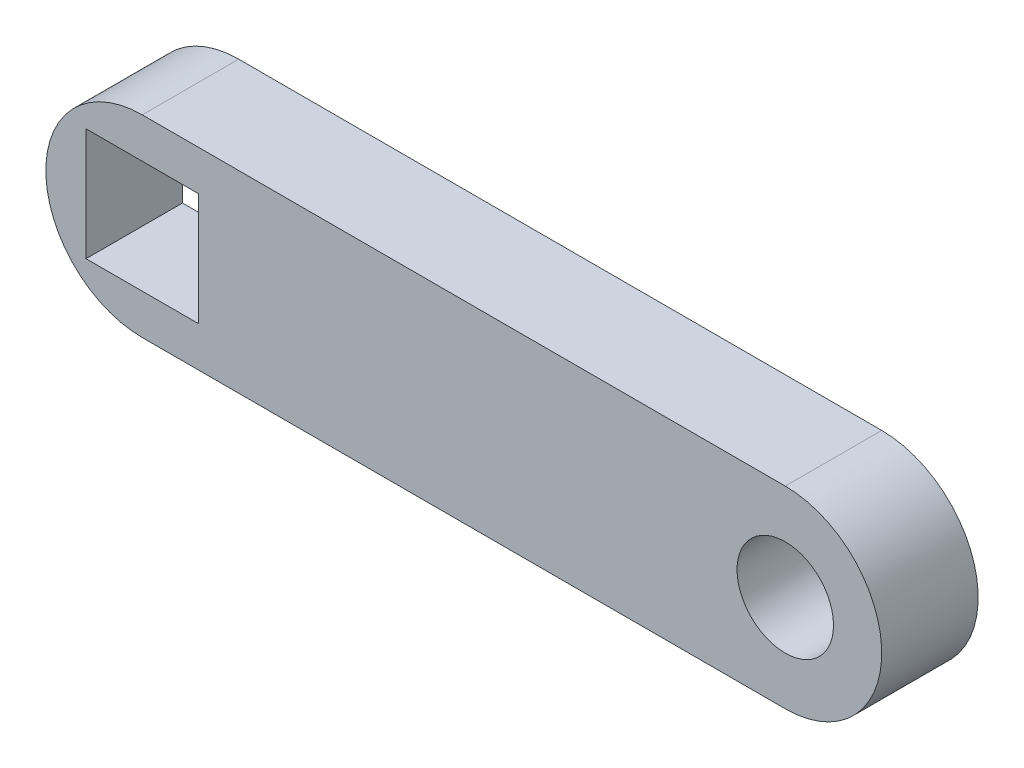
ISO-10303-21;
HEADER;
FILE_DESCRIPTION(('STEP AP214'),'2;1');
FILE_NAME('part.step','',(''),(''),'','','');
FILE_SCHEMA(('AUTOMOTIVE_DESIGN { 1 0 10303 214 1 1 1 1 }'));
ENDSEC;
DATA;
#1=APPLICATION_CONTEXT('core data for automotive mechanical design processes');
#2=APPLICATION_PROTOCOL_DEFINITION('international standard','automotive_design',2000,#1);
#3=PRODUCT_CONTEXT('',#1,'mechanical');
#4=PRODUCT('Part','Part','',(#3));
#5=PRODUCT_RELATED_PRODUCT_CATEGORY('part','',(#4));
#6=PRODUCT_DEFINITION_FORMATION('','',#4);
#7=PRODUCT_DEFINITION_CONTEXT('part definition',#1,'design');
#8=PRODUCT_DEFINITION('design','',#6,#7);
#9=PRODUCT_DEFINITION_SHAPE('','',#8);
#10=(LENGTH_UNIT() NAMED_UNIT(*) SI_UNIT(.MILLI.,.METRE.));
#11=(NAMED_UNIT(*) PLANE_ANGLE_UNIT() SI_UNIT($,.RADIAN.));
#12=(NAMED_UNIT(*) SI_UNIT($,.STERADIAN.) SOLID_ANGLE_UNIT());
#13=UNCERTAINTY_MEASURE_WITH_UNIT(LENGTH_MEASURE(1.E-05),#10,'distance_accuracy_value','');
#14=(GEOMETRIC_REPRESENTATION_CONTEXT(3) GLOBAL_UNCERTAINTY_ASSIGNED_CONTEXT((#13)) GLOBAL_UNIT_ASSIGNED_CONTEXT((#10,
#11,#12)) REPRESENTATION_CONTEXT('',''));
#15=CARTESIAN_POINT('',(0.,0.,0.));
#16=DIRECTION('',(0.,0.,1.));
#17=DIRECTION('',(1.,0.,0.));
#18=AXIS2_PLACEMENT_3D('',#15,#16,#17);
#19=CARTESIAN_POINT('',(0.,1.75,3.));
#20=DIRECTION('',(0.,1.,0.));
#21=DIRECTION('',(0.,0.,1.));
#22=AXIS2_PLACEMENT_3D('',#19,#20,#21);
#23=PLANE('',#22);
#24=DIRECTION('',(1.,0.,0.));
#25=VECTOR('',#24,1.);
#26=CARTESIAN_POINT('',(0.,1.75,0.));
#27=LINE('',#26,#25);
#28=CARTESIAN_POINT('',(-1.75,1.75,0.));
#29=VERTEX_POINT('',#28);
#30=CARTESIAN_POINT('',(1.75,1.75,0.));
#31=VERTEX_POINT('',#30);
#32=EDGE_CURVE('E146',#29,#31,#27,.T.);
#33=ORIENTED_EDGE('',*,*,#32,.T.);
#34=DIRECTION('',(0.,0.,-1.));
#35=VECTOR('',#34,1.);
#36=CARTESIAN_POINT('',(1.75,1.75,3.));
#37=LINE('',#36,#35);
#38=CARTESIAN_POINT('',(1.75,1.75,3.));
#39=VERTEX_POINT('',#38);
#40=EDGE_CURVE('E11',#39,#31,#37,.T.);
#41=ORIENTED_EDGE('',*,*,#40,.F.);
#42=DIRECTION('',(1.,0.,0.));
#43=VECTOR('',#42,1.);
#44=CARTESIAN_POINT('',(0.,1.75,3.));
#45=LINE('',#44,#43);
#46=CARTESIAN_POINT('',(-1.75,1.75,3.));
#47=VERTEX_POINT('',#46);
#48=EDGE_CURVE('E114',#47,#39,#45,.T.);
#49=ORIENTED_EDGE('',*,*,#48,.F.);
#50=DIRECTION('',(0.,0.,-1.));
#51=VECTOR('',#50,1.);
#52=CARTESIAN_POINT('',(-1.75,1.75,3.));
#53=LINE('',#52,#51);
#54=EDGE_CURVE('E54',#47,#29,#53,.T.);
#55=ORIENTED_EDGE('',*,*,#54,.T.);
#56=EDGE_LOOP('',(#33,#41,#49,#55));
#57=FACE_BOUND('',#56,.T.);
#58=ADVANCED_FACE('F35',(#57),#23,.F.);
#59=CARTESIAN_POINT('',(1.75,0.,3.));
#60=DIRECTION('',(1.,0.,0.));
#61=DIRECTION('',(0.,0.,-1.));
#62=AXIS2_PLACEMENT_3D('',#59,#60,#61);
#63=PLANE('',#62);
#64=DIRECTION('',(0.,-1.,0.));
#65=VECTOR('',#64,1.);
#66=CARTESIAN_POINT('',(1.75,0.,0.));
#67=LINE('',#66,#65);
#68=CARTESIAN_POINT('',(1.75,-1.75,0.));
#69=VERTEX_POINT('',#68);
#70=EDGE_CURVE('E120',#31,#69,#67,.T.);
#71=ORIENTED_EDGE('',*,*,#70,.T.);
#72=DIRECTION('',(0.,0.,-1.));
#73=VECTOR('',#72,1.);
#74=CARTESIAN_POINT('',(1.75,-1.75,3.));
#75=LINE('',#74,#73);
#76=CARTESIAN_POINT('',(1.75,-1.75,3.));
#77=VERTEX_POINT('',#76);
#78=EDGE_CURVE('E45',#77,#69,#75,.T.);
#79=ORIENTED_EDGE('',*,*,#78,.F.);
#80=DIRECTION('',(0.,-1.,0.));
#81=VECTOR('',#80,1.);
#82=CARTESIAN_POINT('',(1.75,0.,3.));
#83=LINE('',#82,#81);
#84=EDGE_CURVE('E108',#39,#77,#83,.T.);
#85=ORIENTED_EDGE('',*,*,#84,.F.);
#86=ORIENTED_EDGE('',*,*,#40,.T.);
#87=EDGE_LOOP('',(#71,#79,#85,#86));
#88=FACE_BOUND('',#87,.T.);
#89=ADVANCED_FACE('F119',(#88),#63,.F.);
#90=CARTESIAN_POINT('',(0.,-1.75,3.));
#91=DIRECTION('',(0.,1.,0.));
#92=DIRECTION('',(0.,0.,1.));
#93=AXIS2_PLACEMENT_3D('',#90,#91,#92);
#94=PLANE('',#93);
#95=DIRECTION('',(1.,0.,0.));
#96=VECTOR('',#95,1.);
#97=CARTESIAN_POINT('',(0.,-1.75,0.));
#98=LINE('',#97,#96);
#99=CARTESIAN_POINT('',(-1.75,-1.75,0.));
#100=VERTEX_POINT('',#99);
#101=EDGE_CURVE('E149',#100,#69,#98,.T.);
#102=ORIENTED_EDGE('',*,*,#101,.F.);
#103=DIRECTION('',(0.,0.,-1.));
#104=VECTOR('',#103,1.);
#105=CARTESIAN_POINT('',(-1.75,-1.75,3.));
#106=LINE('',#105,#104);
#107=CARTESIAN_POINT('',(-1.75,-1.75,3.));
#108=VERTEX_POINT('',#107);
#109=EDGE_CURVE('E80',#108,#100,#106,.T.);
#110=ORIENTED_EDGE('',*,*,#109,.F.);
#111=DIRECTION('',(1.,0.,0.));
#112=VECTOR('',#111,1.);
#113=CARTESIAN_POINT('',(0.,-1.75,3.));
#114=LINE('',#113,#112);
#115=EDGE_CURVE('E113',#108,#77,#114,.T.);
#116=ORIENTED_EDGE('',*,*,#115,.T.);
#117=ORIENTED_EDGE('',*,*,#78,.T.);
#118=EDGE_LOOP('',(#102,#110,#116,#117));
#119=FACE_BOUND('',#118,.T.);
#120=ADVANCED_FACE('F124',(#119),#94,.T.);
#121=CARTESIAN_POINT('',(20.,0.,3.));
#122=DIRECTION('',(0.,0.,-1.));
#123=DIRECTION('',(-1.,0.,0.));
#124=AXIS2_PLACEMENT_3D('',#121,#122,#123);
#125=CYLINDRICAL_SURFACE('',#124,3.);
#126=CARTESIAN_POINT('',(20.,0.,0.));
#127=DIRECTION('',(0.,0.,1.));
#128=DIRECTION('',(1.,0.,0.));
#129=AXIS2_PLACEMENT_3D('',#126,#127,#128);
#130=CIRCLE('',#129,3.);
#131=CARTESIAN_POINT('',(20.,3.,0.));
#132=VERTEX_POINT('',#131);
#133=CARTESIAN_POINT('',(20.,-3.,0.));
#134=VERTEX_POINT('',#133);
#135=EDGE_CURVE('E134',#132,#134,#130,.F.);
#136=ORIENTED_EDGE('',*,*,#135,.F.);
#137=DIRECTION('',(0.,0.,-1.));
#138=VECTOR('',#137,1.);
#139=CARTESIAN_POINT('',(20.,3.,3.));
#140=LINE('',#139,#138);
#141=CARTESIAN_POINT('',(20.,3.,3.));
#142=VERTEX_POINT('',#141);
#143=EDGE_CURVE('E39',#142,#132,#140,.T.);
#144=ORIENTED_EDGE('',*,*,#143,.F.);
#145=CARTESIAN_POINT('',(20.,0.,3.));
#146=DIRECTION('',(0.,0.,1.));
#147=DIRECTION('',(1.,0.,0.));
#148=AXIS2_PLACEMENT_3D('',#145,#146,#147);
#149=CIRCLE('',#148,3.);
#150=CARTESIAN_POINT('',(20.,-3.,3.));
#151=VERTEX_POINT('',#150);
#152=EDGE_CURVE('E187',#142,#151,#149,.F.);
#153=ORIENTED_EDGE('',*,*,#152,.T.);
#154=DIRECTION('',(0.,0.,-1.));
#155=VECTOR('',#154,1.);
#156=CARTESIAN_POINT('',(20.,-3.,3.));
#157=LINE('',#156,#155);
#158=EDGE_CURVE('E127',#151,#134,#157,.T.);
#159=ORIENTED_EDGE('',*,*,#158,.T.);
#160=EDGE_LOOP('',(#136,#144,#153,#159));
#161=FACE_BOUND('',#160,.T.);
#162=ADVANCED_FACE('F169',(#161),#125,.T.);
#163=CARTESIAN_POINT('',(0.,3.,3.));
#164=DIRECTION('',(0.,1.,0.));
#165=DIRECTION('',(0.,0.,1.));
#166=AXIS2_PLACEMENT_3D('',#163,#164,#165);
#167=PLANE('',#166);
#168=DIRECTION('',(1.,0.,0.));
#169=VECTOR('',#168,1.);
#170=CARTESIAN_POINT('',(0.,3.,0.));
#171=LINE('',#170,#169);
#172=CARTESIAN_POINT('',(0.,3.,0.));
#173=VERTEX_POINT('',#172);
#174=EDGE_CURVE('E137',#173,#132,#171,.T.);
#175=ORIENTED_EDGE('',*,*,#174,.F.);
#176=DIRECTION('',(0.,0.,-1.));
#177=VECTOR('',#176,1.);
#178=CARTESIAN_POINT('',(0.,3.,3.));
#179=LINE('',#178,#177);
#180=CARTESIAN_POINT('',(0.,3.,3.));
#181=VERTEX_POINT('',#180);
#182=EDGE_CURVE('E159',#181,#173,#179,.T.);
#183=ORIENTED_EDGE('',*,*,#182,.F.);
#184=DIRECTION('',(1.,0.,0.));
#185=VECTOR('',#184,1.);
#186=CARTESIAN_POINT('',(0.,3.,3.));
#187=LINE('',#186,#185);
#188=EDGE_CURVE('E168',#181,#142,#187,.T.);
#189=ORIENTED_EDGE('',*,*,#188,.T.);
#190=ORIENTED_EDGE('',*,*,#143,.T.);
#191=EDGE_LOOP('',(#175,#183,#189,#190));
#192=FACE_BOUND('',#191,.T.);
#193=ADVANCED_FACE('F166',(#192),#167,.T.);
#194=CARTESIAN_POINT('',(0.,0.,3.));
#195=DIRECTION('',(0.,0.,-1.));
#196=DIRECTION('',(-1.,0.,0.));
#197=AXIS2_PLACEMENT_3D('',#194,#195,#196);
#198=CYLINDRICAL_SURFACE('',#197,3.);
#199=CARTESIAN_POINT('',(0.,0.,0.));
#200=DIRECTION('',(0.,0.,1.));
#201=DIRECTION('',(1.,0.,0.));
#202=AXIS2_PLACEMENT_3D('',#199,#200,#201);
#203=CIRCLE('',#202,3.);
#204=CARTESIAN_POINT('',(0.,-3.,0.));
#205=VERTEX_POINT('',#204);
#206=EDGE_CURVE('E140',#173,#205,#203,.T.);
#207=ORIENTED_EDGE('',*,*,#206,.T.);
#208=DIRECTION('',(0.,0.,-1.));
#209=VECTOR('',#208,1.);
#210=CARTESIAN_POINT('',(0.,-3.,3.));
#211=LINE('',#210,#209);
#212=CARTESIAN_POINT('',(0.,-3.,3.));
#213=VERTEX_POINT('',#212);
#214=EDGE_CURVE('E158',#213,#205,#211,.T.);
#215=ORIENTED_EDGE('',*,*,#214,.F.);
#216=CARTESIAN_POINT('',(0.,0.,3.));
#217=DIRECTION('',(0.,0.,1.));
#218=DIRECTION('',(1.,0.,0.));
#219=AXIS2_PLACEMENT_3D('',#216,#217,#218);
#220=CIRCLE('',#219,3.);
#221=EDGE_CURVE('E177',#181,#213,#220,.T.);
#222=ORIENTED_EDGE('',*,*,#221,.F.);
#223=ORIENTED_EDGE('',*,*,#182,.T.);
#224=EDGE_LOOP('',(#207,#215,#222,#223));
#225=FACE_BOUND('',#224,.T.);
#226=ADVANCED_FACE('F175',(#225),#198,.T.);
#227=CARTESIAN_POINT('',(0.,-3.,3.));
#228=DIRECTION('',(0.,-1.,0.));
#229=DIRECTION('',(1.,0.,0.));
#230=AXIS2_PLACEMENT_3D('',#227,#228,#229);
#231=PLANE('',#230);
#232=DIRECTION('',(-1.,0.,0.));
#233=VECTOR('',#232,1.);
#234=CARTESIAN_POINT('',(0.,-3.,0.));
#235=LINE('',#234,#233);
#236=EDGE_CURVE('E143',#134,#205,#235,.T.);
#237=ORIENTED_EDGE('',*,*,#236,.F.);
#238=ORIENTED_EDGE('',*,*,#158,.F.);
#239=DIRECTION('',(-1.,0.,0.));
#240=VECTOR('',#239,1.);
#241=CARTESIAN_POINT('',(0.,-3.,3.));
#242=LINE('',#241,#240);
#243=EDGE_CURVE('E180',#151,#213,#242,.T.);
#244=ORIENTED_EDGE('',*,*,#243,.T.);
#245=ORIENTED_EDGE('',*,*,#214,.T.);
#246=EDGE_LOOP('',(#237,#238,#244,#245));
#247=FACE_BOUND('',#246,.T.);
#248=ADVANCED_FACE('F181',(#247),#231,.T.);
#249=CARTESIAN_POINT('',(20.,0.,3.));
#250=DIRECTION('',(0.,0.,-1.));
#251=DIRECTION('',(-1.,0.,0.));
#252=AXIS2_PLACEMENT_3D('',#249,#250,#251);
#253=CYLINDRICAL_SURFACE('',#252,1.5);
#254=CARTESIAN_POINT('',(20.,0.,3.));
#255=DIRECTION('',(0.,0.,1.));
#256=DIRECTION('',(1.,0.,0.));
#257=AXIS2_PLACEMENT_3D('',#254,#255,#256);
#258=CIRCLE('',#257,1.5);
#259=CARTESIAN_POINT('',(21.5,0.,3.));
#260=VERTEX_POINT('',#259);
#261=EDGE_CURVE('E154',#260,#260,#258,.T.);
#262=ORIENTED_EDGE('',*,*,#261,.T.);
#263=EDGE_LOOP('',(#262));
#264=FACE_BOUND('',#263,.T.);
#265=CARTESIAN_POINT('',(20.,0.,0.));
#266=DIRECTION('',(0.,0.,1.));
#267=DIRECTION('',(1.,0.,0.));
#268=AXIS2_PLACEMENT_3D('',#265,#266,#267);
#269=CIRCLE('',#268,1.5);
#270=CARTESIAN_POINT('',(21.5,0.,0.));
#271=VERTEX_POINT('',#270);
#272=EDGE_CURVE('E131',#271,#271,#269,.T.);
#273=ORIENTED_EDGE('',*,*,#272,.F.);
#274=EDGE_LOOP('',(#273));
#275=FACE_BOUND('',#274,.T.);
#276=ADVANCED_FACE('F37',(#264,#275),#253,.F.);
#277=CARTESIAN_POINT('',(-1.75,0.,3.));
#278=DIRECTION('',(1.,0.,0.));
#279=DIRECTION('',(0.,0.,-1.));
#280=AXIS2_PLACEMENT_3D('',#277,#278,#279);
#281=PLANE('',#280);
#282=DIRECTION('',(0.,-1.,0.));
#283=VECTOR('',#282,1.);
#284=CARTESIAN_POINT('',(-1.75,0.,0.));
#285=LINE('',#284,#283);
#286=EDGE_CURVE('E151',#29,#100,#285,.T.);
#287=ORIENTED_EDGE('',*,*,#286,.F.);
#288=ORIENTED_EDGE('',*,*,#54,.F.);
#289=DIRECTION('',(0.,-1.,0.));
#290=VECTOR('',#289,1.);
#291=CARTESIAN_POINT('',(-1.75,0.,3.));
#292=LINE('',#291,#290);
#293=EDGE_CURVE('E125',#47,#108,#292,.T.);
#294=ORIENTED_EDGE('',*,*,#293,.T.);
#295=ORIENTED_EDGE('',*,*,#109,.T.);
#296=EDGE_LOOP('',(#287,#288,#294,#295));
#297=FACE_BOUND('',#296,.T.);
#298=ADVANCED_FACE('F195',(#297),#281,.T.);
#299=CARTESIAN_POINT('',(0.,0.,3.));
#300=DIRECTION('',(0.,0.,1.));
#301=DIRECTION('',(1.,0.,0.));
#302=AXIS2_PLACEMENT_3D('',#299,#300,#301);
#303=PLANE('',#302);
#304=ORIENTED_EDGE('',*,*,#261,.F.);
#305=EDGE_LOOP('',(#304));
#306=FACE_BOUND('',#305,.T.);
#307=ORIENTED_EDGE('',*,*,#152,.F.);
#308=ORIENTED_EDGE('',*,*,#188,.F.);
#309=ORIENTED_EDGE('',*,*,#221,.T.);
#310=ORIENTED_EDGE('',*,*,#243,.F.);
#311=EDGE_LOOP('',(#307,#308,#309,#310));
#312=FACE_BOUND('',#311,.T.);
#313=ORIENTED_EDGE('',*,*,#48,.T.);
#314=ORIENTED_EDGE('',*,*,#84,.T.);
#315=ORIENTED_EDGE('',*,*,#115,.F.);
#316=ORIENTED_EDGE('',*,*,#293,.F.);
#317=EDGE_LOOP('',(#313,#314,#315,#316));
#318=FACE_BOUND('',#317,.T.);
#319=ADVANCED_FACE('F110',(#306,#312,#318),#303,.T.);
#320=CARTESIAN_POINT('',(0.,0.,0.));
#321=DIRECTION('',(0.,0.,1.));
#322=DIRECTION('',(1.,0.,0.));
#323=AXIS2_PLACEMENT_3D('',#320,#321,#322);
#324=PLANE('',#323);
#325=ORIENTED_EDGE('',*,*,#272,.T.);
#326=EDGE_LOOP('',(#325));
#327=FACE_BOUND('',#326,.T.);
#328=ORIENTED_EDGE('',*,*,#135,.T.);
#329=ORIENTED_EDGE('',*,*,#236,.T.);
#330=ORIENTED_EDGE('',*,*,#206,.F.);
#331=ORIENTED_EDGE('',*,*,#174,.T.);
#332=EDGE_LOOP('',(#328,#329,#330,#331));
#333=FACE_BOUND('',#332,.T.);
#334=ORIENTED_EDGE('',*,*,#32,.F.);
#335=ORIENTED_EDGE('',*,*,#286,.T.);
#336=ORIENTED_EDGE('',*,*,#101,.T.);
#337=ORIENTED_EDGE('',*,*,#70,.F.);
#338=EDGE_LOOP('',(#334,#335,#336,#337));
#339=FACE_BOUND('',#338,.T.);
#340=ADVANCED_FACE('F172',(#327,#333,#339),#324,.F.);
#341=CLOSED_SHELL('',(#58,#89,#120,#162,#193,#226,#248,#276,#298,#319,#340));
#342=MANIFOLD_SOLID_BREP('B2',#341);
#343=ADVANCED_BREP_SHAPE_REPRESENTATION('',(#18,#342),#14);
#344=SHAPE_DEFINITION_REPRESENTATION(#9,#343);
ENDSEC;
END-ISO-10303-21;
